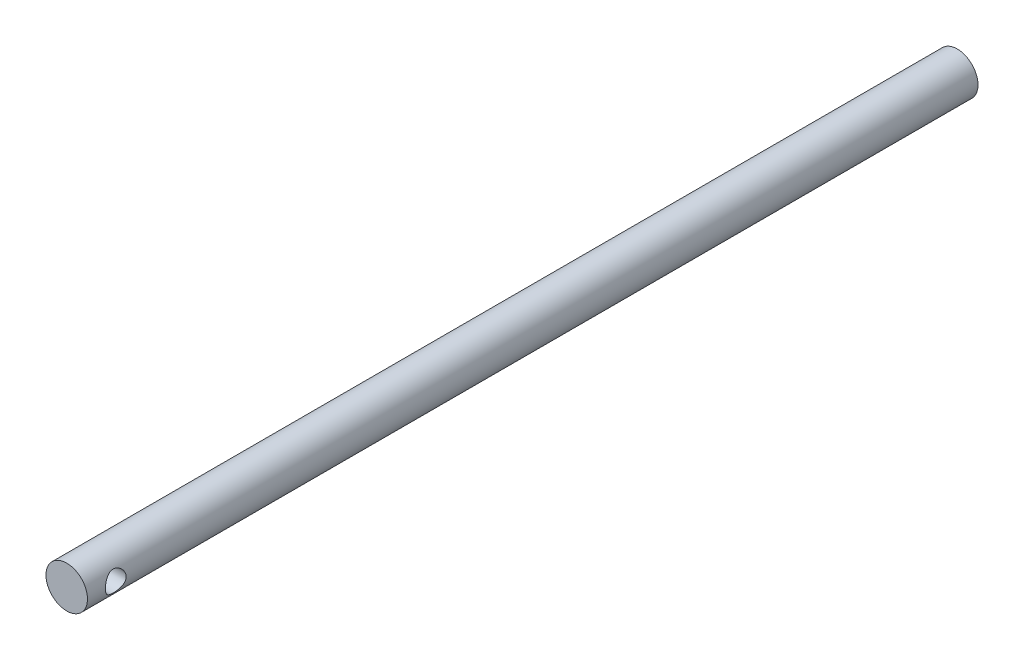
ISO-10303-21;
HEADER;
FILE_DESCRIPTION(('STEP AP214'),'2;1');
FILE_NAME('part.step','',(''),(''),'','','');
FILE_SCHEMA(('AUTOMOTIVE_DESIGN { 1 0 10303 214 1 1 1 1 }'));
ENDSEC;
DATA;
#1=APPLICATION_CONTEXT('core data for automotive mechanical design processes');
#2=APPLICATION_PROTOCOL_DEFINITION('international standard','automotive_design',2000,#1);
#3=PRODUCT_CONTEXT('',#1,'mechanical');
#4=PRODUCT('Part','Part','',(#3));
#5=PRODUCT_RELATED_PRODUCT_CATEGORY('part','',(#4));
#6=PRODUCT_DEFINITION_FORMATION('','',#4);
#7=PRODUCT_DEFINITION_CONTEXT('part definition',#1,'design');
#8=PRODUCT_DEFINITION('design','',#6,#7);
#9=PRODUCT_DEFINITION_SHAPE('','',#8);
#10=(LENGTH_UNIT() NAMED_UNIT(*) SI_UNIT(.MILLI.,.METRE.));
#11=(NAMED_UNIT(*) PLANE_ANGLE_UNIT() SI_UNIT($,.RADIAN.));
#12=(NAMED_UNIT(*) SI_UNIT($,.STERADIAN.) SOLID_ANGLE_UNIT());
#13=UNCERTAINTY_MEASURE_WITH_UNIT(LENGTH_MEASURE(1.E-05),#10,'distance_accuracy_value','');
#14=(GEOMETRIC_REPRESENTATION_CONTEXT(3) GLOBAL_UNCERTAINTY_ASSIGNED_CONTEXT((#13)) GLOBAL_UNIT_ASSIGNED_CONTEXT((#10,
#11,#12)) REPRESENTATION_CONTEXT('',''));
#15=CARTESIAN_POINT('',(0.,0.,0.));
#16=DIRECTION('',(0.,0.,1.));
#17=DIRECTION('',(1.,0.,0.));
#18=AXIS2_PLACEMENT_3D('',#15,#16,#17);
#19=CARTESIAN_POINT('',(0.,0.,204.364));
#20=DIRECTION('',(0.,0.,-1.));
#21=DIRECTION('',(-1.,0.,0.));
#22=AXIS2_PLACEMENT_3D('',#19,#20,#21);
#23=CYLINDRICAL_SURFACE('',#22,4.763);
#24=CARTESIAN_POINT('',(-4.763,0.,195.4825));
#25=CARTESIAN_POINT('',(-4.76299216534579,0.125197057591659,195.482509210743));
#26=CARTESIAN_POINT('',(-4.75801027296265,0.250548693364888,195.492431390146));
#27=CARTESIAN_POINT('',(-4.73856979721227,0.497544365673758,195.531684472839));
#28=CARTESIAN_POINT('',(-4.72409321718975,0.619180901302167,195.561052235169));
#29=CARTESIAN_POINT('',(-4.68717962172751,0.85480001719181,195.637759151602));
#30=CARTESIAN_POINT('',(-4.66477356461255,0.968810342152563,195.685028463962));
#31=CARTESIAN_POINT('',(-4.61405568712183,1.18711259596725,195.795835408907));
#32=CARTESIAN_POINT('',(-4.58574433242275,1.2914052901911,195.859371758806));
#33=CARTESIAN_POINT('',(-4.52380828475232,1.49440985076288,196.005280337203));
#34=CARTESIAN_POINT('',(-4.4899657657005,1.59240238065558,196.088559552339));
#35=CARTESIAN_POINT('',(-4.42149219294914,1.77369225258594,196.269636900796));
#36=CARTESIAN_POINT('',(-4.38686056084027,1.85697839645346,196.367445994433));
#37=CARTESIAN_POINT('',(-4.31763452230999,2.01296763768799,196.583904097497));
#38=CARTESIAN_POINT('',(-4.28325127757211,2.08434913624618,196.703581018373));
#39=CARTESIAN_POINT('',(-4.2220655845843,2.20566963270997,196.955141810489));
#40=CARTESIAN_POINT('',(-4.19525772569206,2.25562394803853,197.087016879511));
#41=CARTESIAN_POINT('',(-4.15471410347569,2.32942241098168,197.351179948602));
#42=CARTESIAN_POINT('',(-4.14029184775821,2.35465062861295,197.482970602609));
#43=CARTESIAN_POINT('',(-4.1243267091321,2.38251688458911,197.749637602161));
#44=CARTESIAN_POINT('',(-4.1227710989124,2.38517724646655,197.884510766082));
#45=CARTESIAN_POINT('',(-4.13216280407461,2.36884777439547,198.136172166909));
#46=CARTESIAN_POINT('',(-4.14163720661038,2.35240892853551,198.253194330358));
#47=CARTESIAN_POINT('',(-4.16944038729712,2.30276725053052,198.482527727171));
#48=CARTESIAN_POINT('',(-4.18777198587888,2.26955907831265,198.594837447544));
#49=CARTESIAN_POINT('',(-4.2316272507693,2.18671659198887,198.814764179205));
#50=CARTESIAN_POINT('',(-4.25730849541309,2.13671768233663,198.922210948708));
#51=CARTESIAN_POINT('',(-4.31297757296167,2.02199277918144,199.127705567803));
#52=CARTESIAN_POINT('',(-4.34296733804025,1.95726017063941,199.225749167432));
#53=CARTESIAN_POINT('',(-4.40846985546674,1.80533430977477,199.422742363408));
#54=CARTESIAN_POINT('',(-4.44420074628811,1.71633385260644,199.520230544422));
#55=CARTESIAN_POINT('',(-4.5140766488992,1.52310161077259,199.699506399374));
#56=CARTESIAN_POINT('',(-4.54822089689885,1.41886258853166,199.781286569829));
#57=CARTESIAN_POINT('',(-4.61301282714378,1.19198005863854,199.930393401742));
#58=CARTESIAN_POINT('',(-4.6434245078182,1.068706678394,199.99687252513));
#59=CARTESIAN_POINT('',(-4.69531493890238,0.810820292186586,200.107604074666));
#60=CARTESIAN_POINT('',(-4.71680078004072,0.676216389875764,200.151874149614));
#61=CARTESIAN_POINT('',(-4.74690900805229,0.41144339988997,200.213291173951));
#62=CARTESIAN_POINT('',(-4.7564494056457,0.281830355000851,200.232380877931));
#63=CARTESIAN_POINT('',(-4.76473881552855,0.0209086172793776,200.248988257197));
#64=CARTESIAN_POINT('',(-4.7634929400482,-0.110399242820211,200.24651615185));
#65=CARTESIAN_POINT('',(-4.75088274351555,-0.360161322784606,200.221192771531));
#66=CARTESIAN_POINT('',(-4.74031015606373,-0.478822980270828,200.199935873304));
#67=CARTESIAN_POINT('',(-4.71113500986292,-0.710656014017156,200.140147031782));
#68=CARTESIAN_POINT('',(-4.69253156585401,-0.823826783473629,200.101613183991));
#69=CARTESIAN_POINT('',(-4.6483129474146,-1.04521322102235,200.00735365219));
#70=CARTESIAN_POINT('',(-4.62251249934379,-1.15319469046815,199.951167914148));
#71=CARTESIAN_POINT('',(-4.56638274836926,-1.358553732888,199.823718403858));
#72=CARTESIAN_POINT('',(-4.5360515178265,-1.45592676181736,199.752448208462));
#73=CARTESIAN_POINT('',(-4.4702712911217,-1.64744475203743,199.588776547074));
#74=CARTESIAN_POINT('',(-4.43461222254851,-1.74033370330715,199.494987258795));
#75=CARTESIAN_POINT('',(-4.36439385616347,-1.90962082876343,199.293078252235));
#76=CARTESIAN_POINT('',(-4.32983533312995,-1.98600759514351,199.184948703474));
#77=CARTESIAN_POINT('',(-4.26410414239982,-2.12360239825768,198.950812637576));
#78=CARTESIAN_POINT('',(-4.23317649217216,-2.18389621796545,198.824193969754));
#79=CARTESIAN_POINT('',(-4.18129653167615,-2.28167425024598,198.560564774112));
#80=CARTESIAN_POINT('',(-4.16033137571858,-2.31918785319258,198.423567893876));
#81=CARTESIAN_POINT('',(-4.13336714695875,-2.36688160774838,198.157138304058));
#82=CARTESIAN_POINT('',(-4.12612458732493,-2.37933996753768,198.028241924939));
#83=CARTESIAN_POINT('',(-4.12393292068541,-2.38314122454736,197.770056810053));
#84=CARTESIAN_POINT('',(-4.12897848501435,-2.37449327437887,197.640768268628));
#85=CARTESIAN_POINT('',(-4.14947468509754,-2.33845705665953,197.3984560394));
#86=CARTESIAN_POINT('',(-4.16388829635677,-2.31293255980741,197.285056224293));
#87=CARTESIAN_POINT('',(-4.20027574925628,-2.24617215642508,197.06427296965));
#88=CARTESIAN_POINT('',(-4.22225202261156,-2.20493119592992,196.95689147819));
#89=CARTESIAN_POINT('',(-4.27309045560461,-2.1048070353998,196.743206893319));
#90=CARTESIAN_POINT('',(-4.30231604799321,-2.04492469128357,196.637460959237));
#91=CARTESIAN_POINT('',(-4.36374940373987,-1.91032316270398,196.43682778469));
#92=CARTESIAN_POINT('',(-4.39595871392353,-1.83559625925784,196.3419462342));
#93=CARTESIAN_POINT('',(-4.4644153063311,-1.6627686054682,196.153744480492));
#94=CARTESIAN_POINT('',(-4.50067769417171,-1.56293103404168,196.06201481569));
#95=CARTESIAN_POINT('',(-4.56956835317565,-1.34830799591743,195.896256237835));
#96=CARTESIAN_POINT('',(-4.60219466047128,-1.23351452335324,195.822236865696));
#97=CARTESIAN_POINT('',(-4.66054929373483,-0.990502133376931,195.693884817343));
#98=CARTESIAN_POINT('',(-4.68622721715351,-0.862194031201199,195.639695034369));
#99=CARTESIAN_POINT('',(-4.71706525575584,-0.66332272843855,195.575679656114));
#100=CARTESIAN_POINT('',(-4.72606116394393,-0.596013635894465,195.557226327863));
#101=CARTESIAN_POINT('',(-4.74125335442261,-0.459747620341674,195.526256777582));
#102=CARTESIAN_POINT('',(-4.74745134675741,-0.390791731041819,195.513736928864));
#103=CARTESIAN_POINT('',(-4.75574310049815,-0.268174698970603,195.497039083902));
#104=CARTESIAN_POINT('',(-4.75845884593144,-0.214724136676516,195.49159262746));
#105=CARTESIAN_POINT('',(-4.76208900318233,-0.10752522840746,195.484321057351));
#106=CARTESIAN_POINT('',(-4.76300336528048,-0.053776874254286,195.482496043637));
#107=CARTESIAN_POINT('',(-4.763,0.,195.4825));
#108=B_SPLINE_CURVE_WITH_KNOTS('',3,(#24,#25,#26,#27,#28,#29,#30,#31,#32,#33,#34,#35,#36,#37,
#38,#39,#40,#41,#42,#43,#44,#45,#46,#47,#48,#49,#50,#51,#52,#53,#54,#55,#56,#57,#58,#59,#60,#61,
#62,#63,#64,#65,#66,#67,#68,#69,#70,#71,#72,#73,#74,#75,#76,#77,#78,#79,#80,#81,#82,#83,#84,#85,
#86,#87,#88,#89,#90,#91,#92,#93,#94,#95,#96,#97,#98,#99,#100,#101,#102,#103,#104,#105,#106,
#107),.UNSPECIFIED.,.T.,.F.,(4,2,2,2,2,2,2,2,2,2,2,2,2,2,2,2,2,2,2,2,2,2,2,2,2,2,2,2,2,2,2,2,2,
2,2,2,2,2,2,2,2,4),(0.,0.375382169046428,0.751477918532452,1.1261212233049,1.50073499582499,
1.89801205838711,2.29559033497308,2.72400081494837,3.15210452919757,3.55457955911958,
3.95665642479062,4.31065104102798,4.66475845549002,5.02711406961257,5.38963269381218,
5.79811757786632,6.20679710646772,6.63445467403688,7.06177185576593,7.45369706257509,
7.8454365238408,8.20681347844329,8.56823027864063,8.93998086630442,9.3118900695717,
9.72032112749683,10.1290336328765,10.5575391556815,10.9854906519809,11.3723604581851,
11.7590625306773,12.1089256088765,12.4589012880946,12.8323902182226,13.2060738686356,
13.6251626562621,14.0444767102244,14.4667554853969,14.6775988230955,14.8883131214555,
15.0495495190321,15.2107903667839),.UNSPECIFIED.);
#109=CARTESIAN_POINT('',(-4.763,0.,195.4825));
#110=VERTEX_POINT('',#109);
#111=EDGE_CURVE('E10',#110,#110,#108,.T.);
#112=ORIENTED_EDGE('',*,*,#111,.T.);
#113=EDGE_LOOP('',(#112));
#114=FACE_BOUND('',#113,.T.);
#115=CARTESIAN_POINT('',(4.763,0.,195.4825));
#116=CARTESIAN_POINT('',(4.76299216534579,-0.125197057591659,195.482509210743));
#117=CARTESIAN_POINT('',(4.75801027296265,-0.250548693364888,195.492431390146));
#118=CARTESIAN_POINT('',(4.73856979721227,-0.497544365673758,195.531684472839));
#119=CARTESIAN_POINT('',(4.72409321718975,-0.619180901302167,195.561052235169));
#120=CARTESIAN_POINT('',(4.68717962172751,-0.85480001719181,195.637759151602));
#121=CARTESIAN_POINT('',(4.66477356461255,-0.968810342152563,195.685028463962));
#122=CARTESIAN_POINT('',(4.61405568712183,-1.18711259596725,195.795835408907));
#123=CARTESIAN_POINT('',(4.58574433242275,-1.2914052901911,195.859371758806));
#124=CARTESIAN_POINT('',(4.52380828475232,-1.49440985076288,196.005280337203));
#125=CARTESIAN_POINT('',(4.4899657657005,-1.59240238065558,196.088559552339));
#126=CARTESIAN_POINT('',(4.42149219294914,-1.77369225258594,196.269636900796));
#127=CARTESIAN_POINT('',(4.38686056084027,-1.85697839645346,196.367445994433));
#128=CARTESIAN_POINT('',(4.31763452230999,-2.01296763768799,196.583904097497));
#129=CARTESIAN_POINT('',(4.28325127757211,-2.08434913624618,196.703581018373));
#130=CARTESIAN_POINT('',(4.2220655845843,-2.20566963270997,196.955141810489));
#131=CARTESIAN_POINT('',(4.19525772569206,-2.25562394803853,197.087016879511));
#132=CARTESIAN_POINT('',(4.15471410347569,-2.32942241098168,197.351179948602));
#133=CARTESIAN_POINT('',(4.14029184775821,-2.35465062861295,197.482970602609));
#134=CARTESIAN_POINT('',(4.1243267091321,-2.38251688458911,197.749637602161));
#135=CARTESIAN_POINT('',(4.1227710989124,-2.38517724646655,197.884510766082));
#136=CARTESIAN_POINT('',(4.13216280407461,-2.36884777439547,198.136172166909));
#137=CARTESIAN_POINT('',(4.14163720661038,-2.35240892853551,198.253194330358));
#138=CARTESIAN_POINT('',(4.16944038729712,-2.30276725053052,198.482527727171));
#139=CARTESIAN_POINT('',(4.18777198587888,-2.26955907831265,198.594837447544));
#140=CARTESIAN_POINT('',(4.2316272507693,-2.18671659198887,198.814764179205));
#141=CARTESIAN_POINT('',(4.25730849541309,-2.13671768233663,198.922210948708));
#142=CARTESIAN_POINT('',(4.31297757296167,-2.02199277918144,199.127705567803));
#143=CARTESIAN_POINT('',(4.34296733804025,-1.95726017063941,199.225749167432));
#144=CARTESIAN_POINT('',(4.40846985546674,-1.80533430977477,199.422742363408));
#145=CARTESIAN_POINT('',(4.44420074628811,-1.71633385260644,199.520230544422));
#146=CARTESIAN_POINT('',(4.5140766488992,-1.52310161077259,199.699506399374));
#147=CARTESIAN_POINT('',(4.54822089689885,-1.41886258853166,199.781286569829));
#148=CARTESIAN_POINT('',(4.61301282714378,-1.19198005863854,199.930393401742));
#149=CARTESIAN_POINT('',(4.6434245078182,-1.068706678394,199.99687252513));
#150=CARTESIAN_POINT('',(4.69531493890238,-0.810820292186586,200.107604074666));
#151=CARTESIAN_POINT('',(4.71680078004072,-0.676216389875764,200.151874149614));
#152=CARTESIAN_POINT('',(4.74690900805229,-0.41144339988997,200.213291173951));
#153=CARTESIAN_POINT('',(4.7564494056457,-0.281830355000851,200.232380877931));
#154=CARTESIAN_POINT('',(4.76473881552855,-0.0209086172793776,200.248988257197));
#155=CARTESIAN_POINT('',(4.7634929400482,0.110399242820211,200.24651615185));
#156=CARTESIAN_POINT('',(4.75088274351555,0.360161322784606,200.221192771531));
#157=CARTESIAN_POINT('',(4.74031015606373,0.478822980270828,200.199935873304));
#158=CARTESIAN_POINT('',(4.71113500986292,0.710656014017156,200.140147031782));
#159=CARTESIAN_POINT('',(4.69253156585401,0.823826783473629,200.101613183991));
#160=CARTESIAN_POINT('',(4.6483129474146,1.04521322102235,200.00735365219));
#161=CARTESIAN_POINT('',(4.62251249934379,1.15319469046815,199.951167914148));
#162=CARTESIAN_POINT('',(4.56638274836926,1.358553732888,199.823718403858));
#163=CARTESIAN_POINT('',(4.5360515178265,1.45592676181736,199.752448208462));
#164=CARTESIAN_POINT('',(4.4702712911217,1.64744475203743,199.588776547074));
#165=CARTESIAN_POINT('',(4.43461222254851,1.74033370330715,199.494987258795));
#166=CARTESIAN_POINT('',(4.36439385616347,1.90962082876343,199.293078252235));
#167=CARTESIAN_POINT('',(4.32983533312995,1.98600759514351,199.184948703474));
#168=CARTESIAN_POINT('',(4.26410414239982,2.12360239825768,198.950812637576));
#169=CARTESIAN_POINT('',(4.23317649217216,2.18389621796545,198.824193969754));
#170=CARTESIAN_POINT('',(4.18129653167615,2.28167425024598,198.560564774112));
#171=CARTESIAN_POINT('',(4.16033137571858,2.31918785319258,198.423567893876));
#172=CARTESIAN_POINT('',(4.13336714695875,2.36688160774838,198.157138304058));
#173=CARTESIAN_POINT('',(4.12612458732493,2.37933996753768,198.028241924939));
#174=CARTESIAN_POINT('',(4.12393292068541,2.38314122454736,197.770056810053));
#175=CARTESIAN_POINT('',(4.12897848501435,2.37449327437887,197.640768268628));
#176=CARTESIAN_POINT('',(4.14947468509754,2.33845705665953,197.3984560394));
#177=CARTESIAN_POINT('',(4.16388829635677,2.31293255980741,197.285056224293));
#178=CARTESIAN_POINT('',(4.20027574925628,2.24617215642508,197.06427296965));
#179=CARTESIAN_POINT('',(4.22225202261156,2.20493119592992,196.95689147819));
#180=CARTESIAN_POINT('',(4.27309045560461,2.1048070353998,196.743206893319));
#181=CARTESIAN_POINT('',(4.30231604799321,2.04492469128357,196.637460959237));
#182=CARTESIAN_POINT('',(4.36374940373987,1.91032316270398,196.43682778469));
#183=CARTESIAN_POINT('',(4.39595871392353,1.83559625925784,196.3419462342));
#184=CARTESIAN_POINT('',(4.4644153063311,1.6627686054682,196.153744480492));
#185=CARTESIAN_POINT('',(4.50067769417171,1.56293103404168,196.06201481569));
#186=CARTESIAN_POINT('',(4.56956835317565,1.34830799591743,195.896256237835));
#187=CARTESIAN_POINT('',(4.60219466047128,1.23351452335324,195.822236865696));
#188=CARTESIAN_POINT('',(4.66054929373483,0.990502133376931,195.693884817343));
#189=CARTESIAN_POINT('',(4.68622721715351,0.862194031201199,195.639695034369));
#190=CARTESIAN_POINT('',(4.71706525575584,0.66332272843855,195.575679656114));
#191=CARTESIAN_POINT('',(4.72606116394393,0.596013635894465,195.557226327863));
#192=CARTESIAN_POINT('',(4.74125335442261,0.459747620341674,195.526256777582));
#193=CARTESIAN_POINT('',(4.74745134675741,0.390791731041819,195.513736928864));
#194=CARTESIAN_POINT('',(4.75574310049815,0.268174698970603,195.497039083902));
#195=CARTESIAN_POINT('',(4.75845884593144,0.214724136676516,195.49159262746));
#196=CARTESIAN_POINT('',(4.76208900318233,0.10752522840746,195.484321057351));
#197=CARTESIAN_POINT('',(4.76300336528048,0.053776874254286,195.482496043637));
#198=CARTESIAN_POINT('',(4.763,0.,195.4825));
#199=B_SPLINE_CURVE_WITH_KNOTS('',3,(#115,#116,#117,#118,#119,#120,#121,#122,#123,#124,#125,
#126,#127,#128,#129,#130,#131,#132,#133,#134,#135,#136,#137,#138,#139,#140,#141,#142,#143,#144,
#145,#146,#147,#148,#149,#150,#151,#152,#153,#154,#155,#156,#157,#158,#159,#160,#161,#162,#163,
#164,#165,#166,#167,#168,#169,#170,#171,#172,#173,#174,#175,#176,#177,#178,#179,#180,#181,#182,
#183,#184,#185,#186,#187,#188,#189,#190,#191,#192,#193,#194,#195,#196,#197,#198),.UNSPECIFIED.,
.T.,.F.,(4,2,2,2,2,2,2,2,2,2,2,2,2,2,2,2,2,2,2,2,2,2,2,2,2,2,2,2,2,2,2,2,2,2,2,2,2,2,2,2,2,4),
(0.,0.375382169046428,0.751477918532452,1.1261212233049,1.50073499582499,1.89801205838711,
2.29559033497308,2.72400081494837,3.15210452919757,3.55457955911958,3.95665642479062,
4.31065104102798,4.66475845549002,5.02711406961257,5.38963269381218,5.79811757786632,
6.20679710646772,6.63445467403688,7.06177185576593,7.45369706257509,7.8454365238408,
8.20681347844329,8.56823027864063,8.93998086630442,9.3118900695717,9.72032112749683,
10.1290336328765,10.5575391556815,10.9854906519809,11.3723604581851,11.7590625306773,
12.1089256088765,12.4589012880946,12.8323902182226,13.2060738686356,13.6251626562621,
14.0444767102244,14.4667554853969,14.6775988230955,14.8883131214555,15.0495495190321,
15.2107903667839),.UNSPECIFIED.);
#200=CARTESIAN_POINT('',(4.763,0.,195.4825));
#201=VERTEX_POINT('',#200);
#202=EDGE_CURVE('E56',#201,#201,#199,.T.);
#203=ORIENTED_EDGE('',*,*,#202,.T.);
#204=EDGE_LOOP('',(#203));
#205=FACE_BOUND('',#204,.T.);
#206=CARTESIAN_POINT('',(0.,0.,204.364));
#207=DIRECTION('',(0.,0.,1.));
#208=DIRECTION('',(1.,0.,0.));
#209=AXIS2_PLACEMENT_3D('',#206,#207,#208);
#210=CIRCLE('',#209,4.763);
#211=CARTESIAN_POINT('',(4.763,0.,204.364));
#212=VERTEX_POINT('',#211);
#213=EDGE_CURVE('E61',#212,#212,#210,.T.);
#214=ORIENTED_EDGE('',*,*,#213,.F.);
#215=EDGE_LOOP('',(#214));
#216=FACE_BOUND('',#215,.T.);
#217=CARTESIAN_POINT('',(0.,0.,0.));
#218=DIRECTION('',(0.,0.,1.));
#219=DIRECTION('',(1.,0.,0.));
#220=AXIS2_PLACEMENT_3D('',#217,#218,#219);
#221=CIRCLE('',#220,4.763);
#222=CARTESIAN_POINT('',(4.763,0.,0.));
#223=VERTEX_POINT('',#222);
#224=EDGE_CURVE('E66',#223,#223,#221,.T.);
#225=ORIENTED_EDGE('',*,*,#224,.T.);
#226=EDGE_LOOP('',(#225));
#227=FACE_BOUND('',#226,.T.);
#228=ADVANCED_FACE('F44',(#114,#205,#216,#227),#23,.T.);
#229=CARTESIAN_POINT('',(0.,0.,204.364));
#230=DIRECTION('',(0.,0.,1.));
#231=DIRECTION('',(1.,0.,0.));
#232=AXIS2_PLACEMENT_3D('',#229,#230,#231);
#233=PLANE('',#232);
#234=ORIENTED_EDGE('',*,*,#213,.T.);
#235=EDGE_LOOP('',(#234));
#236=FACE_BOUND('',#235,.T.);
#237=ADVANCED_FACE('F78',(#236),#233,.T.);
#238=CARTESIAN_POINT('',(0.,0.,0.));
#239=DIRECTION('',(0.,0.,1.));
#240=DIRECTION('',(1.,0.,0.));
#241=AXIS2_PLACEMENT_3D('',#238,#239,#240);
#242=PLANE('',#241);
#243=ORIENTED_EDGE('',*,*,#224,.F.);
#244=EDGE_LOOP('',(#243));
#245=FACE_BOUND('',#244,.T.);
#246=ADVANCED_FACE('F76',(#245),#242,.F.);
#247=CARTESIAN_POINT('',(-4.763,0.,197.864));
#248=DIRECTION('',(1.,0.,0.));
#249=DIRECTION('',(0.,0.,-1.));
#250=AXIS2_PLACEMENT_3D('',#247,#248,#249);
#251=CYLINDRICAL_SURFACE('',#250,2.3815);
#252=ORIENTED_EDGE('',*,*,#202,.F.);
#253=EDGE_LOOP('',(#252));
#254=FACE_BOUND('',#253,.T.);
#255=ORIENTED_EDGE('',*,*,#111,.F.);
#256=EDGE_LOOP('',(#255));
#257=FACE_BOUND('',#256,.T.);
#258=ADVANCED_FACE('F72',(#254,#257),#251,.F.);
#259=CLOSED_SHELL('',(#228,#237,#246,#258));
#260=MANIFOLD_SOLID_BREP('B2',#259);
#261=ADVANCED_BREP_SHAPE_REPRESENTATION('',(#18,#260),#14);
#262=SHAPE_DEFINITION_REPRESENTATION(#9,#261);
ENDSEC;
END-ISO-10303-21;
